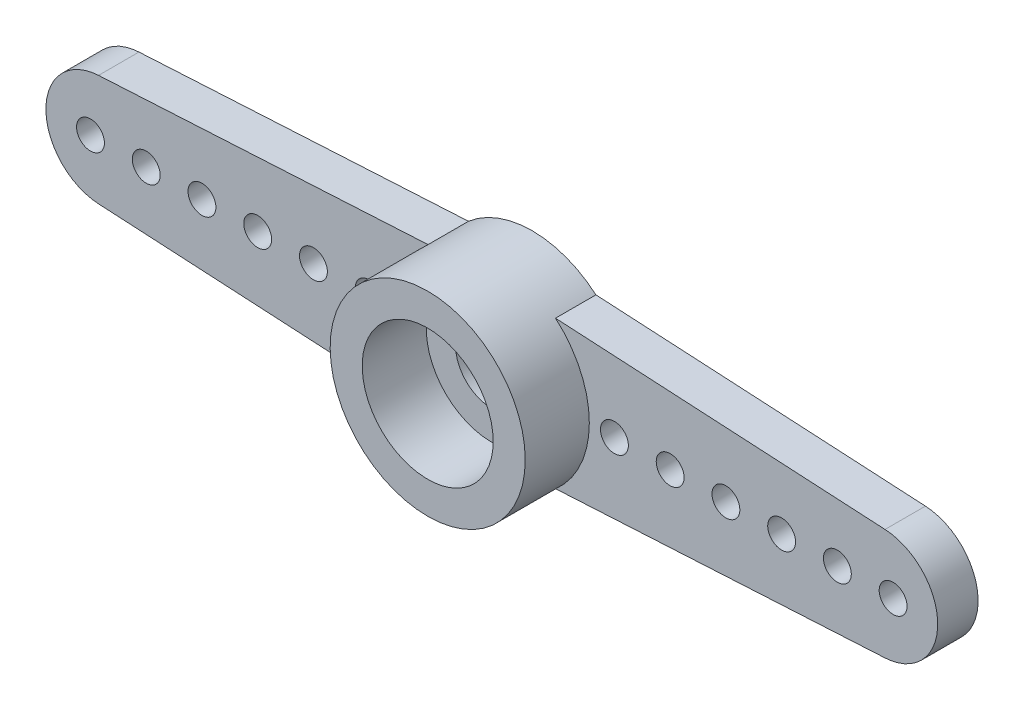
ISO-10303-21;
HEADER;
FILE_DESCRIPTION(('STEP AP214'),'2;1');
FILE_NAME('part.step','',(''),(''),'','','');
FILE_SCHEMA(('AUTOMOTIVE_DESIGN { 1 0 10303 214 1 1 1 1 }'));
ENDSEC;
DATA;
#1=APPLICATION_CONTEXT('core data for automotive mechanical design processes');
#2=APPLICATION_PROTOCOL_DEFINITION('international standard','automotive_design',2000,#1);
#3=PRODUCT_CONTEXT('',#1,'mechanical');
#4=PRODUCT('Part','Part','',(#3));
#5=PRODUCT_RELATED_PRODUCT_CATEGORY('part','',(#4));
#6=PRODUCT_DEFINITION_FORMATION('','',#4);
#7=PRODUCT_DEFINITION_CONTEXT('part definition',#1,'design');
#8=PRODUCT_DEFINITION('design','',#6,#7);
#9=PRODUCT_DEFINITION_SHAPE('','',#8);
#10=(LENGTH_UNIT() NAMED_UNIT(*) SI_UNIT(.MILLI.,.METRE.));
#11=(NAMED_UNIT(*) PLANE_ANGLE_UNIT() SI_UNIT($,.RADIAN.));
#12=(NAMED_UNIT(*) SI_UNIT($,.STERADIAN.) SOLID_ANGLE_UNIT());
#13=UNCERTAINTY_MEASURE_WITH_UNIT(LENGTH_MEASURE(1.E-05),#10,'distance_accuracy_value','');
#14=(GEOMETRIC_REPRESENTATION_CONTEXT(3) GLOBAL_UNCERTAINTY_ASSIGNED_CONTEXT((#13)) GLOBAL_UNIT_ASSIGNED_CONTEXT((#10,
#11,#12)) REPRESENTATION_CONTEXT('',''));
#15=CARTESIAN_POINT('',(0.,0.,0.));
#16=DIRECTION('',(0.,0.,1.));
#17=DIRECTION('',(1.,0.,0.));
#18=AXIS2_PLACEMENT_3D('',#15,#16,#17);
#19=CARTESIAN_POINT('',(0.,0.,1.45));
#20=DIRECTION('',(0.,0.,-1.));
#21=DIRECTION('',(-1.,0.,0.));
#22=AXIS2_PLACEMENT_3D('',#19,#20,#21);
#23=CYLINDRICAL_SURFACE('',#22,3.5);
#24=CARTESIAN_POINT('',(0.,0.,3.75));
#25=DIRECTION('',(0.,0.,1.));
#26=DIRECTION('',(1.,0.,0.));
#27=AXIS2_PLACEMENT_3D('',#24,#25,#26);
#28=CIRCLE('',#27,3.5);
#29=CARTESIAN_POINT('',(3.5,0.,3.75));
#30=VERTEX_POINT('',#29);
#31=EDGE_CURVE('E176',#30,#30,#28,.T.);
#32=ORIENTED_EDGE('',*,*,#31,.F.);
#33=EDGE_LOOP('',(#32));
#34=FACE_BOUND('',#33,.T.);
#35=CARTESIAN_POINT('',(0.,0.,1.45));
#36=DIRECTION('',(0.,0.,1.));
#37=DIRECTION('',(1.,0.,0.));
#38=AXIS2_PLACEMENT_3D('',#35,#36,#37);
#39=CIRCLE('',#38,3.5);
#40=CARTESIAN_POINT('',(2.28637267303474,-2.65,1.45));
#41=VERTEX_POINT('',#40);
#42=CARTESIAN_POINT('',(2.28637267303474,2.65,1.45));
#43=VERTEX_POINT('',#42);
#44=EDGE_CURVE('E184',#41,#43,#39,.T.);
#45=ORIENTED_EDGE('',*,*,#44,.T.);
#46=DIRECTION('',(0.,0.,-1.));
#47=VECTOR('',#46,1.);
#48=CARTESIAN_POINT('',(2.28637267303474,2.65,1.45));
#49=LINE('',#48,#47);
#50=CARTESIAN_POINT('',(2.28637267303474,2.65,0.));
#51=VERTEX_POINT('',#50);
#52=EDGE_CURVE('E202',#43,#51,#49,.T.);
#53=ORIENTED_EDGE('',*,*,#52,.T.);
#54=CARTESIAN_POINT('',(0.,0.,0.));
#55=DIRECTION('',(0.,0.,1.));
#56=DIRECTION('',(1.,0.,0.));
#57=AXIS2_PLACEMENT_3D('',#54,#55,#56);
#58=CIRCLE('',#57,3.5);
#59=CARTESIAN_POINT('',(-2.28637267303474,2.65,0.));
#60=VERTEX_POINT('',#59);
#61=EDGE_CURVE('E203',#51,#60,#58,.T.);
#62=ORIENTED_EDGE('',*,*,#61,.T.);
#63=DIRECTION('',(0.,0.,-1.));
#64=VECTOR('',#63,1.);
#65=CARTESIAN_POINT('',(-2.28637267303474,2.65,1.45));
#66=LINE('',#65,#64);
#67=CARTESIAN_POINT('',(-2.28637267303474,2.65,1.45));
#68=VERTEX_POINT('',#67);
#69=EDGE_CURVE('E64',#68,#60,#66,.T.);
#70=ORIENTED_EDGE('',*,*,#69,.F.);
#71=CARTESIAN_POINT('',(0.,0.,1.45));
#72=DIRECTION('',(0.,0.,1.));
#73=DIRECTION('',(1.,0.,0.));
#74=AXIS2_PLACEMENT_3D('',#71,#72,#73);
#75=CIRCLE('',#74,3.5);
#76=CARTESIAN_POINT('',(-2.28637267303474,-2.65,1.45));
#77=VERTEX_POINT('',#76);
#78=EDGE_CURVE('E59',#68,#77,#75,.T.);
#79=ORIENTED_EDGE('',*,*,#78,.T.);
#80=DIRECTION('',(0.,0.,-1.));
#81=VECTOR('',#80,1.);
#82=CARTESIAN_POINT('',(-2.28637267303474,-2.65,1.45));
#83=LINE('',#82,#81);
#84=CARTESIAN_POINT('',(-2.28637267303474,-2.65,0.));
#85=VERTEX_POINT('',#84);
#86=EDGE_CURVE('E134',#77,#85,#83,.T.);
#87=ORIENTED_EDGE('',*,*,#86,.T.);
#88=CARTESIAN_POINT('',(2.28637267303474,-2.65,0.));
#89=VERTEX_POINT('',#88);
#90=EDGE_CURVE('E183',#85,#89,#58,.T.);
#91=ORIENTED_EDGE('',*,*,#90,.T.);
#92=DIRECTION('',(0.,0.,-1.));
#93=VECTOR('',#92,1.);
#94=CARTESIAN_POINT('',(2.28637267303474,-2.65,1.45));
#95=LINE('',#94,#93);
#96=EDGE_CURVE('E189',#41,#89,#95,.T.);
#97=ORIENTED_EDGE('',*,*,#96,.F.);
#98=EDGE_LOOP('',(#45,#53,#62,#70,#79,#87,#91,#97));
#99=FACE_BOUND('',#98,.T.);
#100=ADVANCED_FACE('F41',(#34,#99),#23,.T.);
#101=CARTESIAN_POINT('',(4.4,0.,3.75));
#102=DIRECTION('',(0.,0.,-1.));
#103=DIRECTION('',(-1.,0.,0.));
#104=AXIS2_PLACEMENT_3D('',#101,#102,#103);
#105=CYLINDRICAL_SURFACE('',#104,0.500000000000001);
#106=CARTESIAN_POINT('',(4.4,0.,1.45));
#107=DIRECTION('',(0.,0.,1.));
#108=DIRECTION('',(1.,0.,0.));
#109=AXIS2_PLACEMENT_3D('',#106,#107,#108);
#110=CIRCLE('',#109,0.500000000000001);
#111=CARTESIAN_POINT('',(4.9,0.,1.45));
#112=VERTEX_POINT('',#111);
#113=EDGE_CURVE('E51',#112,#112,#110,.T.);
#114=ORIENTED_EDGE('',*,*,#113,.T.);
#115=EDGE_LOOP('',(#114));
#116=FACE_BOUND('',#115,.T.);
#117=CARTESIAN_POINT('',(4.4,0.,0.));
#118=DIRECTION('',(0.,0.,-1.));
#119=DIRECTION('',(-1.,0.,0.));
#120=AXIS2_PLACEMENT_3D('',#117,#118,#119);
#121=CIRCLE('',#120,0.500000000000001);
#122=CARTESIAN_POINT('',(3.9,0.,0.));
#123=VERTEX_POINT('',#122);
#124=EDGE_CURVE('E11',#123,#123,#121,.T.);
#125=ORIENTED_EDGE('',*,*,#124,.T.);
#126=EDGE_LOOP('',(#125));
#127=FACE_BOUND('',#126,.T.);
#128=ADVANCED_FACE('F43',(#116,#127),#105,.F.);
#129=CARTESIAN_POINT('',(6.4,0.,3.75));
#130=DIRECTION('',(0.,0.,-1.));
#131=DIRECTION('',(-1.,0.,0.));
#132=AXIS2_PLACEMENT_3D('',#129,#130,#131);
#133=CYLINDRICAL_SURFACE('',#132,0.500000000000001);
#134=CARTESIAN_POINT('',(6.4,0.,1.45));
#135=DIRECTION('',(0.,0.,1.));
#136=DIRECTION('',(1.,0.,0.));
#137=AXIS2_PLACEMENT_3D('',#134,#135,#136);
#138=CIRCLE('',#137,0.500000000000001);
#139=CARTESIAN_POINT('',(6.9,0.,1.45));
#140=VERTEX_POINT('',#139);
#141=EDGE_CURVE('E243',#140,#140,#138,.T.);
#142=ORIENTED_EDGE('',*,*,#141,.T.);
#143=EDGE_LOOP('',(#142));
#144=FACE_BOUND('',#143,.T.);
#145=CARTESIAN_POINT('',(6.4,0.,0.));
#146=DIRECTION('',(0.,0.,-1.));
#147=DIRECTION('',(-1.,0.,0.));
#148=AXIS2_PLACEMENT_3D('',#145,#146,#147);
#149=CIRCLE('',#148,0.500000000000001);
#150=CARTESIAN_POINT('',(5.9,0.,0.));
#151=VERTEX_POINT('',#150);
#152=EDGE_CURVE('E247',#151,#151,#149,.T.);
#153=ORIENTED_EDGE('',*,*,#152,.T.);
#154=EDGE_LOOP('',(#153));
#155=FACE_BOUND('',#154,.T.);
#156=ADVANCED_FACE('F329',(#144,#155),#133,.F.);
#157=CARTESIAN_POINT('',(8.4,0.,3.75));
#158=DIRECTION('',(0.,0.,-1.));
#159=DIRECTION('',(-1.,0.,0.));
#160=AXIS2_PLACEMENT_3D('',#157,#158,#159);
#161=CYLINDRICAL_SURFACE('',#160,0.500000000000001);
#162=CARTESIAN_POINT('',(8.4,0.,1.45));
#163=DIRECTION('',(0.,0.,1.));
#164=DIRECTION('',(1.,0.,0.));
#165=AXIS2_PLACEMENT_3D('',#162,#163,#164);
#166=CIRCLE('',#165,0.500000000000001);
#167=CARTESIAN_POINT('',(8.9,0.,1.45));
#168=VERTEX_POINT('',#167);
#169=EDGE_CURVE('E235',#168,#168,#166,.T.);
#170=ORIENTED_EDGE('',*,*,#169,.T.);
#171=EDGE_LOOP('',(#170));
#172=FACE_BOUND('',#171,.T.);
#173=CARTESIAN_POINT('',(8.4,0.,0.));
#174=DIRECTION('',(0.,0.,-1.));
#175=DIRECTION('',(-1.,0.,0.));
#176=AXIS2_PLACEMENT_3D('',#173,#174,#175);
#177=CIRCLE('',#176,0.500000000000001);
#178=CARTESIAN_POINT('',(7.9,0.,0.));
#179=VERTEX_POINT('',#178);
#180=EDGE_CURVE('E239',#179,#179,#177,.T.);
#181=ORIENTED_EDGE('',*,*,#180,.T.);
#182=EDGE_LOOP('',(#181));
#183=FACE_BOUND('',#182,.T.);
#184=ADVANCED_FACE('F339',(#172,#183),#161,.F.);
#185=CARTESIAN_POINT('',(10.4,0.,3.75));
#186=DIRECTION('',(0.,0.,-1.));
#187=DIRECTION('',(-1.,0.,0.));
#188=AXIS2_PLACEMENT_3D('',#185,#186,#187);
#189=CYLINDRICAL_SURFACE('',#188,0.500000000000001);
#190=CARTESIAN_POINT('',(10.4,0.,1.45));
#191=DIRECTION('',(0.,0.,1.));
#192=DIRECTION('',(1.,0.,0.));
#193=AXIS2_PLACEMENT_3D('',#190,#191,#192);
#194=CIRCLE('',#193,0.500000000000001);
#195=CARTESIAN_POINT('',(10.9,0.,1.45));
#196=VERTEX_POINT('',#195);
#197=EDGE_CURVE('E188',#196,#196,#194,.T.);
#198=ORIENTED_EDGE('',*,*,#197,.T.);
#199=EDGE_LOOP('',(#198));
#200=FACE_BOUND('',#199,.T.);
#201=CARTESIAN_POINT('',(10.4,0.,0.));
#202=DIRECTION('',(0.,0.,-1.));
#203=DIRECTION('',(-1.,0.,0.));
#204=AXIS2_PLACEMENT_3D('',#201,#202,#203);
#205=CIRCLE('',#204,0.500000000000001);
#206=CARTESIAN_POINT('',(9.9,0.,0.));
#207=VERTEX_POINT('',#206);
#208=EDGE_CURVE('E231',#207,#207,#205,.T.);
#209=ORIENTED_EDGE('',*,*,#208,.T.);
#210=EDGE_LOOP('',(#209));
#211=FACE_BOUND('',#210,.T.);
#212=ADVANCED_FACE('F336',(#200,#211),#189,.F.);
#213=CARTESIAN_POINT('',(0.152869471242723,-2.76783488533948,1.45));
#214=DIRECTION('',(0.055146658226505,-0.998478265204831,0.));
#215=DIRECTION('',(0.998478265204831,0.055146658226505,0.));
#216=AXIS2_PLACEMENT_3D('',#213,#214,#215);
#217=PLANE('',#216);
#218=DIRECTION('',(-0.998478265204831,-0.055146658226505,0.));
#219=VECTOR('',#218,1.);
#220=CARTESIAN_POINT('',(0.152869471242723,-2.76783488533948,0.));
#221=LINE('',#220,#219);
#222=CARTESIAN_POINT('',(14.110293316453,-1.99695653040966,0.));
#223=VERTEX_POINT('',#222);
#224=EDGE_CURVE('E206',#223,#89,#221,.T.);
#225=ORIENTED_EDGE('',*,*,#224,.F.);
#226=DIRECTION('',(0.,0.,-1.));
#227=VECTOR('',#226,1.);
#228=CARTESIAN_POINT('',(14.110293316453,-1.99695653040966,1.45));
#229=LINE('',#228,#227);
#230=CARTESIAN_POINT('',(14.110293316453,-1.99695653040966,1.45));
#231=VERTEX_POINT('',#230);
#232=EDGE_CURVE('E222',#231,#223,#229,.T.);
#233=ORIENTED_EDGE('',*,*,#232,.F.);
#234=DIRECTION('',(-0.998478265204831,-0.055146658226505,0.));
#235=VECTOR('',#234,1.);
#236=CARTESIAN_POINT('',(0.152869471242723,-2.76783488533948,1.45));
#237=LINE('',#236,#235);
#238=EDGE_CURVE('E190',#231,#41,#237,.T.);
#239=ORIENTED_EDGE('',*,*,#238,.T.);
#240=ORIENTED_EDGE('',*,*,#96,.T.);
#241=EDGE_LOOP('',(#225,#233,#239,#240));
#242=FACE_BOUND('',#241,.T.);
#243=ADVANCED_FACE('F334',(#242),#217,.T.);
#244=CARTESIAN_POINT('',(14.,0.,1.45));
#245=DIRECTION('',(0.,0.,-1.));
#246=DIRECTION('',(-1.,0.,0.));
#247=AXIS2_PLACEMENT_3D('',#244,#245,#246);
#248=CYLINDRICAL_SURFACE('',#247,2.);
#249=CARTESIAN_POINT('',(14.,0.,0.));
#250=DIRECTION('',(0.,0.,1.));
#251=DIRECTION('',(1.,0.,0.));
#252=AXIS2_PLACEMENT_3D('',#249,#250,#251);
#253=CIRCLE('',#252,2.);
#254=CARTESIAN_POINT('',(14.110293316453,1.99695653040966,0.));
#255=VERTEX_POINT('',#254);
#256=EDGE_CURVE('E210',#223,#255,#253,.T.);
#257=ORIENTED_EDGE('',*,*,#256,.T.);
#258=DIRECTION('',(0.,0.,-1.));
#259=VECTOR('',#258,1.);
#260=CARTESIAN_POINT('',(14.110293316453,1.99695653040966,1.45));
#261=LINE('',#260,#259);
#262=CARTESIAN_POINT('',(14.110293316453,1.99695653040966,1.45));
#263=VERTEX_POINT('',#262);
#264=EDGE_CURVE('E219',#263,#255,#261,.T.);
#265=ORIENTED_EDGE('',*,*,#264,.F.);
#266=CARTESIAN_POINT('',(14.,0.,1.45));
#267=DIRECTION('',(0.,0.,1.));
#268=DIRECTION('',(1.,0.,0.));
#269=AXIS2_PLACEMENT_3D('',#266,#267,#268);
#270=CIRCLE('',#269,2.);
#271=EDGE_CURVE('E194',#231,#263,#270,.T.);
#272=ORIENTED_EDGE('',*,*,#271,.F.);
#273=ORIENTED_EDGE('',*,*,#232,.T.);
#274=EDGE_LOOP('',(#257,#265,#272,#273));
#275=FACE_BOUND('',#274,.T.);
#276=ADVANCED_FACE('F374',(#275),#248,.T.);
#277=CARTESIAN_POINT('',(0.152869471242723,2.76783488533948,1.45));
#278=DIRECTION('',(0.055146658226505,0.998478265204831,0.));
#279=DIRECTION('',(-0.998478265204831,0.055146658226505,0.));
#280=AXIS2_PLACEMENT_3D('',#277,#278,#279);
#281=PLANE('',#280);
#282=DIRECTION('',(0.998478265204831,-0.055146658226505,0.));
#283=VECTOR('',#282,1.);
#284=CARTESIAN_POINT('',(0.152869471242723,2.76783488533948,0.));
#285=LINE('',#284,#283);
#286=EDGE_CURVE('E195',#51,#255,#285,.T.);
#287=ORIENTED_EDGE('',*,*,#286,.F.);
#288=ORIENTED_EDGE('',*,*,#52,.F.);
#289=DIRECTION('',(0.998478265204831,-0.055146658226505,0.));
#290=VECTOR('',#289,1.);
#291=CARTESIAN_POINT('',(0.152869471242723,2.76783488533948,1.45));
#292=LINE('',#291,#290);
#293=EDGE_CURVE('E198',#43,#263,#292,.T.);
#294=ORIENTED_EDGE('',*,*,#293,.T.);
#295=ORIENTED_EDGE('',*,*,#264,.T.);
#296=EDGE_LOOP('',(#287,#288,#294,#295));
#297=FACE_BOUND('',#296,.T.);
#298=ADVANCED_FACE('F366',(#297),#281,.T.);
#299=CARTESIAN_POINT('',(0.,0.,1.45));
#300=DIRECTION('',(0.,0.,1.));
#301=DIRECTION('',(1.,0.,0.));
#302=AXIS2_PLACEMENT_3D('',#299,#300,#301);
#303=PLANE('',#302);
#304=CARTESIAN_POINT('',(12.4,0.,1.45));
#305=DIRECTION('',(0.,0.,1.));
#306=DIRECTION('',(1.,0.,0.));
#307=AXIS2_PLACEMENT_3D('',#304,#305,#306);
#308=CIRCLE('',#307,0.500000000000001);
#309=CARTESIAN_POINT('',(12.9,0.,1.45));
#310=VERTEX_POINT('',#309);
#311=EDGE_CURVE('E155',#310,#310,#308,.T.);
#312=ORIENTED_EDGE('',*,*,#311,.F.);
#313=EDGE_LOOP('',(#312));
#314=FACE_BOUND('',#313,.T.);
#315=CARTESIAN_POINT('',(14.4,0.,1.45));
#316=DIRECTION('',(0.,0.,1.));
#317=DIRECTION('',(1.,0.,0.));
#318=AXIS2_PLACEMENT_3D('',#315,#316,#317);
#319=CIRCLE('',#318,0.500000000000001);
#320=CARTESIAN_POINT('',(14.9,0.,1.45));
#321=VERTEX_POINT('',#320);
#322=EDGE_CURVE('E167',#321,#321,#319,.T.);
#323=ORIENTED_EDGE('',*,*,#322,.F.);
#324=EDGE_LOOP('',(#323));
#325=FACE_BOUND('',#324,.T.);
#326=ORIENTED_EDGE('',*,*,#44,.F.);
#327=ORIENTED_EDGE('',*,*,#238,.F.);
#328=ORIENTED_EDGE('',*,*,#271,.T.);
#329=ORIENTED_EDGE('',*,*,#293,.F.);
#330=EDGE_LOOP('',(#326,#327,#328,#329));
#331=FACE_BOUND('',#330,.T.);
#332=ORIENTED_EDGE('',*,*,#197,.F.);
#333=EDGE_LOOP('',(#332));
#334=FACE_BOUND('',#333,.T.);
#335=ORIENTED_EDGE('',*,*,#169,.F.);
#336=EDGE_LOOP('',(#335));
#337=FACE_BOUND('',#336,.T.);
#338=ORIENTED_EDGE('',*,*,#141,.F.);
#339=EDGE_LOOP('',(#338));
#340=FACE_BOUND('',#339,.T.);
#341=ORIENTED_EDGE('',*,*,#113,.F.);
#342=EDGE_LOOP('',(#341));
#343=FACE_BOUND('',#342,.T.);
#344=ADVANCED_FACE('F354',(#314,#325,#331,#334,#337,#340,#343),#303,.T.);
#345=CARTESIAN_POINT('',(0.,0.,0.));
#346=DIRECTION('',(0.,0.,1.));
#347=DIRECTION('',(1.,0.,0.));
#348=AXIS2_PLACEMENT_3D('',#345,#346,#347);
#349=PLANE('',#348);
#350=CARTESIAN_POINT('',(-12.4,0.,0.));
#351=DIRECTION('',(0.,0.,1.));
#352=DIRECTION('',(1.,0.,0.));
#353=AXIS2_PLACEMENT_3D('',#350,#351,#352);
#354=CIRCLE('',#353,0.500000000000001);
#355=CARTESIAN_POINT('',(-11.9,0.,0.));
#356=VERTEX_POINT('',#355);
#357=EDGE_CURVE('E270',#356,#356,#354,.T.);
#358=ORIENTED_EDGE('',*,*,#357,.T.);
#359=EDGE_LOOP('',(#358));
#360=FACE_BOUND('',#359,.T.);
#361=CARTESIAN_POINT('',(-10.4,0.,0.));
#362=DIRECTION('',(0.,0.,1.));
#363=DIRECTION('',(1.,0.,0.));
#364=AXIS2_PLACEMENT_3D('',#361,#362,#363);
#365=CIRCLE('',#364,0.500000000000001);
#366=CARTESIAN_POINT('',(-9.9,0.,0.));
#367=VERTEX_POINT('',#366);
#368=EDGE_CURVE('E609',#367,#367,#365,.T.);
#369=ORIENTED_EDGE('',*,*,#368,.T.);
#370=EDGE_LOOP('',(#369));
#371=FACE_BOUND('',#370,.T.);
#372=CARTESIAN_POINT('',(-8.4,0.,0.));
#373=DIRECTION('',(0.,0.,1.));
#374=DIRECTION('',(1.,0.,0.));
#375=AXIS2_PLACEMENT_3D('',#372,#373,#374);
#376=CIRCLE('',#375,0.500000000000001);
#377=CARTESIAN_POINT('',(-7.9,0.,0.));
#378=VERTEX_POINT('',#377);
#379=EDGE_CURVE('E613',#378,#378,#376,.T.);
#380=ORIENTED_EDGE('',*,*,#379,.T.);
#381=EDGE_LOOP('',(#380));
#382=FACE_BOUND('',#381,.T.);
#383=CARTESIAN_POINT('',(-6.4,0.,0.));
#384=DIRECTION('',(0.,0.,1.));
#385=DIRECTION('',(1.,0.,0.));
#386=AXIS2_PLACEMENT_3D('',#383,#384,#385);
#387=CIRCLE('',#386,0.500000000000001);
#388=CARTESIAN_POINT('',(-5.9,0.,0.));
#389=VERTEX_POINT('',#388);
#390=EDGE_CURVE('E618',#389,#389,#387,.T.);
#391=ORIENTED_EDGE('',*,*,#390,.T.);
#392=EDGE_LOOP('',(#391));
#393=FACE_BOUND('',#392,.T.);
#394=CARTESIAN_POINT('',(-4.4,0.,0.));
#395=DIRECTION('',(0.,0.,1.));
#396=DIRECTION('',(1.,0.,0.));
#397=AXIS2_PLACEMENT_3D('',#394,#395,#396);
#398=CIRCLE('',#397,0.500000000000001);
#399=CARTESIAN_POINT('',(-3.9,0.,0.));
#400=VERTEX_POINT('',#399);
#401=EDGE_CURVE('E293',#400,#400,#398,.T.);
#402=ORIENTED_EDGE('',*,*,#401,.T.);
#403=EDGE_LOOP('',(#402));
#404=FACE_BOUND('',#403,.T.);
#405=CARTESIAN_POINT('',(-14.4,0.,0.));
#406=DIRECTION('',(0.,0.,1.));
#407=DIRECTION('',(1.,0.,0.));
#408=AXIS2_PLACEMENT_3D('',#405,#406,#407);
#409=CIRCLE('',#408,0.500000000000001);
#410=CARTESIAN_POINT('',(-13.9,0.,0.));
#411=VERTEX_POINT('',#410);
#412=EDGE_CURVE('E264',#411,#411,#409,.T.);
#413=ORIENTED_EDGE('',*,*,#412,.T.);
#414=EDGE_LOOP('',(#413));
#415=FACE_BOUND('',#414,.T.);
#416=CARTESIAN_POINT('',(0.,0.,0.));
#417=DIRECTION('',(0.,0.,1.));
#418=DIRECTION('',(1.,0.,0.));
#419=AXIS2_PLACEMENT_3D('',#416,#417,#418);
#420=CIRCLE('',#419,2.3);
#421=CARTESIAN_POINT('',(2.3,0.,0.));
#422=VERTEX_POINT('',#421);
#423=EDGE_CURVE('E258',#422,#422,#420,.T.);
#424=ORIENTED_EDGE('',*,*,#423,.T.);
#425=EDGE_LOOP('',(#424));
#426=FACE_BOUND('',#425,.T.);
#427=CARTESIAN_POINT('',(12.4,0.,0.));
#428=DIRECTION('',(0.,0.,-1.));
#429=DIRECTION('',(-1.,0.,0.));
#430=AXIS2_PLACEMENT_3D('',#427,#428,#429);
#431=CIRCLE('',#430,0.500000000000001);
#432=CARTESIAN_POINT('',(11.9,0.,0.));
#433=VERTEX_POINT('',#432);
#434=EDGE_CURVE('E159',#433,#433,#431,.T.);
#435=ORIENTED_EDGE('',*,*,#434,.F.);
#436=EDGE_LOOP('',(#435));
#437=FACE_BOUND('',#436,.T.);
#438=CARTESIAN_POINT('',(14.4,0.,0.));
#439=DIRECTION('',(0.,0.,-1.));
#440=DIRECTION('',(-1.,0.,0.));
#441=AXIS2_PLACEMENT_3D('',#438,#439,#440);
#442=CIRCLE('',#441,0.500000000000001);
#443=CARTESIAN_POINT('',(13.9,0.,0.));
#444=VERTEX_POINT('',#443);
#445=EDGE_CURVE('E163',#444,#444,#442,.T.);
#446=ORIENTED_EDGE('',*,*,#445,.F.);
#447=EDGE_LOOP('',(#446));
#448=FACE_BOUND('',#447,.T.);
#449=ORIENTED_EDGE('',*,*,#224,.T.);
#450=ORIENTED_EDGE('',*,*,#90,.F.);
#451=DIRECTION('',(0.998478265204831,-0.055146658226505,0.));
#452=VECTOR('',#451,1.);
#453=CARTESIAN_POINT('',(-0.152869471242723,-2.76783488533948,0.));
#454=LINE('',#453,#452);
#455=CARTESIAN_POINT('',(-14.110293316453,-1.99695653040966,0.));
#456=VERTEX_POINT('',#455);
#457=EDGE_CURVE('E115',#456,#85,#454,.T.);
#458=ORIENTED_EDGE('',*,*,#457,.F.);
#459=CARTESIAN_POINT('',(-14.,0.,0.));
#460=DIRECTION('',(0.,0.,-1.));
#461=DIRECTION('',(-1.,0.,0.));
#462=AXIS2_PLACEMENT_3D('',#459,#460,#461);
#463=CIRCLE('',#462,2.);
#464=CARTESIAN_POINT('',(-14.110293316453,1.99695653040966,0.));
#465=VERTEX_POINT('',#464);
#466=EDGE_CURVE('E140',#456,#465,#463,.T.);
#467=ORIENTED_EDGE('',*,*,#466,.T.);
#468=DIRECTION('',(-0.998478265204831,-0.055146658226505,0.));
#469=VECTOR('',#468,1.);
#470=CARTESIAN_POINT('',(-0.152869471242723,2.76783488533948,0.));
#471=LINE('',#470,#469);
#472=EDGE_CURVE('E121',#60,#465,#471,.T.);
#473=ORIENTED_EDGE('',*,*,#472,.F.);
#474=ORIENTED_EDGE('',*,*,#61,.F.);
#475=ORIENTED_EDGE('',*,*,#286,.T.);
#476=ORIENTED_EDGE('',*,*,#256,.F.);
#477=EDGE_LOOP('',(#449,#450,#458,#467,#473,#474,#475,#476));
#478=FACE_BOUND('',#477,.T.);
#479=ORIENTED_EDGE('',*,*,#208,.F.);
#480=EDGE_LOOP('',(#479));
#481=FACE_BOUND('',#480,.T.);
#482=ORIENTED_EDGE('',*,*,#180,.F.);
#483=EDGE_LOOP('',(#482));
#484=FACE_BOUND('',#483,.T.);
#485=ORIENTED_EDGE('',*,*,#152,.F.);
#486=EDGE_LOOP('',(#485));
#487=FACE_BOUND('',#486,.T.);
#488=ORIENTED_EDGE('',*,*,#124,.F.);
#489=EDGE_LOOP('',(#488));
#490=FACE_BOUND('',#489,.T.);
#491=ADVANCED_FACE('F304',(#360,#371,#382,#393,#404,#415,#426,#437,#448,#478,#481,#484,#487,
#490),#349,.F.);
#492=CARTESIAN_POINT('',(0.,0.,3.75));
#493=DIRECTION('',(0.,0.,1.));
#494=DIRECTION('',(1.,0.,0.));
#495=AXIS2_PLACEMENT_3D('',#492,#493,#494);
#496=PLANE('',#495);
#497=ORIENTED_EDGE('',*,*,#31,.T.);
#498=EDGE_LOOP('',(#497));
#499=FACE_BOUND('',#498,.T.);
#500=CARTESIAN_POINT('',(0.,0.,3.75));
#501=DIRECTION('',(0.,0.,1.));
#502=DIRECTION('',(1.,0.,0.));
#503=AXIS2_PLACEMENT_3D('',#500,#501,#502);
#504=CIRCLE('',#503,2.35);
#505=CARTESIAN_POINT('',(2.35,0.,3.75));
#506=VERTEX_POINT('',#505);
#507=EDGE_CURVE('E172',#506,#506,#504,.T.);
#508=ORIENTED_EDGE('',*,*,#507,.F.);
#509=EDGE_LOOP('',(#508));
#510=FACE_BOUND('',#509,.T.);
#511=ADVANCED_FACE('F353',(#499,#510),#496,.T.);
#512=CARTESIAN_POINT('',(0.,0.,3.75));
#513=DIRECTION('',(0.,0.,-1.));
#514=DIRECTION('',(-1.,0.,0.));
#515=AXIS2_PLACEMENT_3D('',#512,#513,#514);
#516=CYLINDRICAL_SURFACE('',#515,2.35);
#517=ORIENTED_EDGE('',*,*,#507,.T.);
#518=EDGE_LOOP('',(#517));
#519=FACE_BOUND('',#518,.T.);
#520=CARTESIAN_POINT('',(0.,0.,1.45));
#521=DIRECTION('',(0.,0.,1.));
#522=DIRECTION('',(1.,0.,0.));
#523=AXIS2_PLACEMENT_3D('',#520,#521,#522);
#524=CIRCLE('',#523,2.35);
#525=CARTESIAN_POINT('',(2.35,0.,1.45));
#526=VERTEX_POINT('',#525);
#527=EDGE_CURVE('E171',#526,#526,#524,.T.);
#528=ORIENTED_EDGE('',*,*,#527,.F.);
#529=EDGE_LOOP('',(#528));
#530=FACE_BOUND('',#529,.T.);
#531=ADVANCED_FACE('F363',(#519,#530),#516,.F.);
#532=CARTESIAN_POINT('',(0.,0.,1.45));
#533=DIRECTION('',(0.,0.,1.));
#534=DIRECTION('',(1.,0.,0.));
#535=AXIS2_PLACEMENT_3D('',#532,#533,#534);
#536=CIRCLE('',#535,1.3);
#537=CARTESIAN_POINT('',(1.3,0.,1.45));
#538=VERTEX_POINT('',#537);
#539=EDGE_CURVE('E254',#538,#538,#536,.F.);
#540=ORIENTED_EDGE('',*,*,#539,.T.);
#541=EDGE_LOOP('',(#540));
#542=FACE_BOUND('',#541,.T.);
#543=ORIENTED_EDGE('',*,*,#527,.T.);
#544=EDGE_LOOP('',(#543));
#545=FACE_BOUND('',#544,.T.);
#546=ADVANCED_FACE('F369',(#542,#545),#303,.T.);
#547=CARTESIAN_POINT('',(14.4,0.,3.75));
#548=DIRECTION('',(0.,0.,-1.));
#549=DIRECTION('',(-1.,0.,0.));
#550=AXIS2_PLACEMENT_3D('',#547,#548,#549);
#551=CYLINDRICAL_SURFACE('',#550,0.500000000000001);
#552=ORIENTED_EDGE('',*,*,#322,.T.);
#553=EDGE_LOOP('',(#552));
#554=FACE_BOUND('',#553,.T.);
#555=ORIENTED_EDGE('',*,*,#445,.T.);
#556=EDGE_LOOP('',(#555));
#557=FACE_BOUND('',#556,.T.);
#558=ADVANCED_FACE('F438',(#554,#557),#551,.F.);
#559=CARTESIAN_POINT('',(12.4,0.,3.75));
#560=DIRECTION('',(0.,0.,-1.));
#561=DIRECTION('',(-1.,0.,0.));
#562=AXIS2_PLACEMENT_3D('',#559,#560,#561);
#563=CYLINDRICAL_SURFACE('',#562,0.500000000000001);
#564=ORIENTED_EDGE('',*,*,#311,.T.);
#565=EDGE_LOOP('',(#564));
#566=FACE_BOUND('',#565,.T.);
#567=ORIENTED_EDGE('',*,*,#434,.T.);
#568=EDGE_LOOP('',(#567));
#569=FACE_BOUND('',#568,.T.);
#570=ADVANCED_FACE('F442',(#566,#569),#563,.F.);
#571=CARTESIAN_POINT('',(0.,0.,1.45));
#572=DIRECTION('',(0.,0.,1.));
#573=DIRECTION('',(-1.,0.,0.));
#574=AXIS2_PLACEMENT_3D('',#571,#572,#573);
#575=PLANE('',#574);
#576=CARTESIAN_POINT('',(-12.4,0.,1.45));
#577=DIRECTION('',(0.,0.,1.));
#578=DIRECTION('',(1.,0.,0.));
#579=AXIS2_PLACEMENT_3D('',#576,#577,#578);
#580=CIRCLE('',#579,0.500000000000001);
#581=CARTESIAN_POINT('',(-11.9,0.,1.45));
#582=VERTEX_POINT('',#581);
#583=EDGE_CURVE('E45',#582,#582,#580,.F.);
#584=ORIENTED_EDGE('',*,*,#583,.T.);
#585=EDGE_LOOP('',(#584));
#586=FACE_BOUND('',#585,.T.);
#587=CARTESIAN_POINT('',(-10.4,0.,1.45));
#588=DIRECTION('',(0.,0.,1.));
#589=DIRECTION('',(1.,0.,0.));
#590=AXIS2_PLACEMENT_3D('',#587,#588,#589);
#591=CIRCLE('',#590,0.500000000000001);
#592=CARTESIAN_POINT('',(-9.9,0.,1.45));
#593=VERTEX_POINT('',#592);
#594=EDGE_CURVE('E277',#593,#593,#591,.F.);
#595=ORIENTED_EDGE('',*,*,#594,.T.);
#596=EDGE_LOOP('',(#595));
#597=FACE_BOUND('',#596,.T.);
#598=CARTESIAN_POINT('',(-8.4,0.,1.45));
#599=DIRECTION('',(0.,0.,1.));
#600=DIRECTION('',(1.,0.,0.));
#601=AXIS2_PLACEMENT_3D('',#598,#599,#600);
#602=CIRCLE('',#601,0.500000000000001);
#603=CARTESIAN_POINT('',(-7.9,0.,1.45));
#604=VERTEX_POINT('',#603);
#605=EDGE_CURVE('E274',#604,#604,#602,.F.);
#606=ORIENTED_EDGE('',*,*,#605,.T.);
#607=EDGE_LOOP('',(#606));
#608=FACE_BOUND('',#607,.T.);
#609=CARTESIAN_POINT('',(-6.4,0.,1.45));
#610=DIRECTION('',(0.,0.,1.));
#611=DIRECTION('',(1.,0.,0.));
#612=AXIS2_PLACEMENT_3D('',#609,#610,#611);
#613=CIRCLE('',#612,0.500000000000001);
#614=CARTESIAN_POINT('',(-5.9,0.,1.45));
#615=VERTEX_POINT('',#614);
#616=EDGE_CURVE('E269',#615,#615,#613,.F.);
#617=ORIENTED_EDGE('',*,*,#616,.T.);
#618=EDGE_LOOP('',(#617));
#619=FACE_BOUND('',#618,.T.);
#620=CARTESIAN_POINT('',(-4.4,0.,1.45));
#621=DIRECTION('',(0.,0.,1.));
#622=DIRECTION('',(1.,0.,0.));
#623=AXIS2_PLACEMENT_3D('',#620,#621,#622);
#624=CIRCLE('',#623,0.500000000000001);
#625=CARTESIAN_POINT('',(-3.9,0.,1.45));
#626=VERTEX_POINT('',#625);
#627=EDGE_CURVE('E265',#626,#626,#624,.F.);
#628=ORIENTED_EDGE('',*,*,#627,.T.);
#629=EDGE_LOOP('',(#628));
#630=FACE_BOUND('',#629,.T.);
#631=CARTESIAN_POINT('',(-14.4,0.,1.45));
#632=DIRECTION('',(0.,0.,1.));
#633=DIRECTION('',(1.,0.,0.));
#634=AXIS2_PLACEMENT_3D('',#631,#632,#633);
#635=CIRCLE('',#634,0.500000000000001);
#636=CARTESIAN_POINT('',(-13.9,0.,1.45));
#637=VERTEX_POINT('',#636);
#638=EDGE_CURVE('E260',#637,#637,#635,.F.);
#639=ORIENTED_EDGE('',*,*,#638,.T.);
#640=EDGE_LOOP('',(#639));
#641=FACE_BOUND('',#640,.T.);
#642=ORIENTED_EDGE('',*,*,#78,.F.);
#643=DIRECTION('',(-0.998478265204831,-0.055146658226505,0.));
#644=VECTOR('',#643,1.);
#645=CARTESIAN_POINT('',(-0.152869471242723,2.76783488533948,1.45));
#646=LINE('',#645,#644);
#647=CARTESIAN_POINT('',(-14.110293316453,1.99695653040966,1.45));
#648=VERTEX_POINT('',#647);
#649=EDGE_CURVE('E108',#68,#648,#646,.T.);
#650=ORIENTED_EDGE('',*,*,#649,.T.);
#651=CARTESIAN_POINT('',(-14.,0.,1.45));
#652=DIRECTION('',(0.,0.,-1.));
#653=DIRECTION('',(-1.,0.,0.));
#654=AXIS2_PLACEMENT_3D('',#651,#652,#653);
#655=CIRCLE('',#654,2.);
#656=CARTESIAN_POINT('',(-14.110293316453,-1.99695653040966,1.45));
#657=VERTEX_POINT('',#656);
#658=EDGE_CURVE('E112',#657,#648,#655,.T.);
#659=ORIENTED_EDGE('',*,*,#658,.F.);
#660=DIRECTION('',(0.998478265204831,-0.055146658226505,0.));
#661=VECTOR('',#660,1.);
#662=CARTESIAN_POINT('',(-0.152869471242723,-2.76783488533948,1.45));
#663=LINE('',#662,#661);
#664=EDGE_CURVE('E131',#657,#77,#663,.T.);
#665=ORIENTED_EDGE('',*,*,#664,.T.);
#666=EDGE_LOOP('',(#642,#650,#659,#665));
#667=FACE_BOUND('',#666,.T.);
#668=ADVANCED_FACE('F110',(#586,#597,#608,#619,#630,#641,#667),#575,.T.);
#669=CARTESIAN_POINT('',(-0.152869471242723,2.76783488533948,1.45));
#670=DIRECTION('',(0.055146658226505,-0.998478265204831,0.));
#671=DIRECTION('',(0.998478265204831,0.055146658226505,0.));
#672=AXIS2_PLACEMENT_3D('',#669,#670,#671);
#673=PLANE('',#672);
#674=ORIENTED_EDGE('',*,*,#472,.T.);
#675=DIRECTION('',(0.,0.,-1.));
#676=VECTOR('',#675,1.);
#677=CARTESIAN_POINT('',(-14.110293316453,1.99695653040966,1.45));
#678=LINE('',#677,#676);
#679=EDGE_CURVE('E118',#648,#465,#678,.T.);
#680=ORIENTED_EDGE('',*,*,#679,.F.);
#681=ORIENTED_EDGE('',*,*,#649,.F.);
#682=ORIENTED_EDGE('',*,*,#69,.T.);
#683=EDGE_LOOP('',(#674,#680,#681,#682));
#684=FACE_BOUND('',#683,.T.);
#685=ADVANCED_FACE('F119',(#684),#673,.F.);
#686=CARTESIAN_POINT('',(-14.,0.,1.45));
#687=DIRECTION('',(0.,0.,-1.));
#688=DIRECTION('',(-1.,0.,0.));
#689=AXIS2_PLACEMENT_3D('',#686,#687,#688);
#690=CYLINDRICAL_SURFACE('',#689,2.);
#691=ORIENTED_EDGE('',*,*,#466,.F.);
#692=DIRECTION('',(0.,0.,-1.));
#693=VECTOR('',#692,1.);
#694=CARTESIAN_POINT('',(-14.110293316453,-1.99695653040966,1.45));
#695=LINE('',#694,#693);
#696=EDGE_CURVE('E126',#657,#456,#695,.T.);
#697=ORIENTED_EDGE('',*,*,#696,.F.);
#698=ORIENTED_EDGE('',*,*,#658,.T.);
#699=ORIENTED_EDGE('',*,*,#679,.T.);
#700=EDGE_LOOP('',(#691,#697,#698,#699));
#701=FACE_BOUND('',#700,.T.);
#702=ADVANCED_FACE('F128',(#701),#690,.T.);
#703=CARTESIAN_POINT('',(-0.152869471242723,-2.76783488533948,1.45));
#704=DIRECTION('',(0.055146658226505,0.998478265204831,0.));
#705=DIRECTION('',(-0.998478265204831,0.055146658226505,0.));
#706=AXIS2_PLACEMENT_3D('',#703,#704,#705);
#707=PLANE('',#706);
#708=ORIENTED_EDGE('',*,*,#457,.T.);
#709=ORIENTED_EDGE('',*,*,#86,.F.);
#710=ORIENTED_EDGE('',*,*,#664,.F.);
#711=ORIENTED_EDGE('',*,*,#696,.T.);
#712=EDGE_LOOP('',(#708,#709,#710,#711));
#713=FACE_BOUND('',#712,.T.);
#714=ADVANCED_FACE('F310',(#713),#707,.F.);
#715=CARTESIAN_POINT('',(0.,0.,0.7));
#716=DIRECTION('',(0.,0.,-1.));
#717=DIRECTION('',(-1.,0.,0.));
#718=AXIS2_PLACEMENT_3D('',#715,#716,#717);
#719=CYLINDRICAL_SURFACE('',#718,2.3);
#720=CARTESIAN_POINT('',(0.,0.,0.7));
#721=DIRECTION('',(0.,0.,1.));
#722=DIRECTION('',(1.,0.,0.));
#723=AXIS2_PLACEMENT_3D('',#720,#721,#722);
#724=CIRCLE('',#723,2.3);
#725=CARTESIAN_POINT('',(2.3,0.,0.7));
#726=VERTEX_POINT('',#725);
#727=EDGE_CURVE('E141',#726,#726,#724,.T.);
#728=ORIENTED_EDGE('',*,*,#727,.T.);
#729=EDGE_LOOP('',(#728));
#730=FACE_BOUND('',#729,.T.);
#731=ORIENTED_EDGE('',*,*,#423,.F.);
#732=EDGE_LOOP('',(#731));
#733=FACE_BOUND('',#732,.T.);
#734=ADVANCED_FACE('F307',(#730,#733),#719,.F.);
#735=CARTESIAN_POINT('',(0.,0.,0.7));
#736=DIRECTION('',(0.,0.,-1.));
#737=DIRECTION('',(1.,0.,0.));
#738=AXIS2_PLACEMENT_3D('',#735,#736,#737);
#739=PLANE('',#738);
#740=CARTESIAN_POINT('',(0.,0.,0.7));
#741=DIRECTION('',(0.,0.,1.));
#742=DIRECTION('',(1.,0.,0.));
#743=AXIS2_PLACEMENT_3D('',#740,#741,#742);
#744=CIRCLE('',#743,1.3);
#745=CARTESIAN_POINT('',(1.3,0.,0.7));
#746=VERTEX_POINT('',#745);
#747=EDGE_CURVE('E259',#746,#746,#744,.T.);
#748=ORIENTED_EDGE('',*,*,#747,.T.);
#749=EDGE_LOOP('',(#748));
#750=FACE_BOUND('',#749,.T.);
#751=ORIENTED_EDGE('',*,*,#727,.F.);
#752=EDGE_LOOP('',(#751));
#753=FACE_BOUND('',#752,.T.);
#754=ADVANCED_FACE('F309',(#750,#753),#739,.T.);
#755=CARTESIAN_POINT('',(0.,0.,3.75));
#756=DIRECTION('',(0.,0.,-1.));
#757=DIRECTION('',(-1.,0.,0.));
#758=AXIS2_PLACEMENT_3D('',#755,#756,#757);
#759=CYLINDRICAL_SURFACE('',#758,1.3);
#760=ORIENTED_EDGE('',*,*,#539,.F.);
#761=EDGE_LOOP('',(#760));
#762=FACE_BOUND('',#761,.T.);
#763=ORIENTED_EDGE('',*,*,#747,.F.);
#764=EDGE_LOOP('',(#763));
#765=FACE_BOUND('',#764,.T.);
#766=ADVANCED_FACE('F317',(#762,#765),#759,.F.);
#767=CARTESIAN_POINT('',(-14.4,0.,3.75));
#768=DIRECTION('',(0.,0.,-1.));
#769=DIRECTION('',(-1.,0.,0.));
#770=AXIS2_PLACEMENT_3D('',#767,#768,#769);
#771=CYLINDRICAL_SURFACE('',#770,0.500000000000001);
#772=ORIENTED_EDGE('',*,*,#638,.F.);
#773=EDGE_LOOP('',(#772));
#774=FACE_BOUND('',#773,.T.);
#775=ORIENTED_EDGE('',*,*,#412,.F.);
#776=EDGE_LOOP('',(#775));
#777=FACE_BOUND('',#776,.T.);
#778=ADVANCED_FACE('F542',(#774,#777),#771,.F.);
#779=CARTESIAN_POINT('',(-4.4,0.,3.75));
#780=DIRECTION('',(0.,0.,-1.));
#781=DIRECTION('',(-1.,0.,0.));
#782=AXIS2_PLACEMENT_3D('',#779,#780,#781);
#783=CYLINDRICAL_SURFACE('',#782,0.500000000000001);
#784=ORIENTED_EDGE('',*,*,#627,.F.);
#785=EDGE_LOOP('',(#784));
#786=FACE_BOUND('',#785,.T.);
#787=ORIENTED_EDGE('',*,*,#401,.F.);
#788=EDGE_LOOP('',(#787));
#789=FACE_BOUND('',#788,.T.);
#790=ADVANCED_FACE('F552',(#786,#789),#783,.F.);
#791=CARTESIAN_POINT('',(-6.4,0.,3.75));
#792=DIRECTION('',(0.,0.,-1.));
#793=DIRECTION('',(-1.,0.,0.));
#794=AXIS2_PLACEMENT_3D('',#791,#792,#793);
#795=CYLINDRICAL_SURFACE('',#794,0.500000000000001);
#796=ORIENTED_EDGE('',*,*,#616,.F.);
#797=EDGE_LOOP('',(#796));
#798=FACE_BOUND('',#797,.T.);
#799=ORIENTED_EDGE('',*,*,#390,.F.);
#800=EDGE_LOOP('',(#799));
#801=FACE_BOUND('',#800,.T.);
#802=ADVANCED_FACE('F562',(#798,#801),#795,.F.);
#803=CARTESIAN_POINT('',(-8.4,0.,3.75));
#804=DIRECTION('',(0.,0.,-1.));
#805=DIRECTION('',(-1.,0.,0.));
#806=AXIS2_PLACEMENT_3D('',#803,#804,#805);
#807=CYLINDRICAL_SURFACE('',#806,0.500000000000001);
#808=ORIENTED_EDGE('',*,*,#605,.F.);
#809=EDGE_LOOP('',(#808));
#810=FACE_BOUND('',#809,.T.);
#811=ORIENTED_EDGE('',*,*,#379,.F.);
#812=EDGE_LOOP('',(#811));
#813=FACE_BOUND('',#812,.T.);
#814=ADVANCED_FACE('F572',(#810,#813),#807,.F.);
#815=CARTESIAN_POINT('',(-10.4,0.,3.75));
#816=DIRECTION('',(0.,0.,-1.));
#817=DIRECTION('',(-1.,0.,0.));
#818=AXIS2_PLACEMENT_3D('',#815,#816,#817);
#819=CYLINDRICAL_SURFACE('',#818,0.500000000000001);
#820=ORIENTED_EDGE('',*,*,#594,.F.);
#821=EDGE_LOOP('',(#820));
#822=FACE_BOUND('',#821,.T.);
#823=ORIENTED_EDGE('',*,*,#368,.F.);
#824=EDGE_LOOP('',(#823));
#825=FACE_BOUND('',#824,.T.);
#826=ADVANCED_FACE('F582',(#822,#825),#819,.F.);
#827=CARTESIAN_POINT('',(-12.4,0.,3.75));
#828=DIRECTION('',(0.,0.,-1.));
#829=DIRECTION('',(-1.,0.,0.));
#830=AXIS2_PLACEMENT_3D('',#827,#828,#829);
#831=CYLINDRICAL_SURFACE('',#830,0.500000000000001);
#832=ORIENTED_EDGE('',*,*,#583,.F.);
#833=EDGE_LOOP('',(#832));
#834=FACE_BOUND('',#833,.T.);
#835=ORIENTED_EDGE('',*,*,#357,.F.);
#836=EDGE_LOOP('',(#835));
#837=FACE_BOUND('',#836,.T.);
#838=ADVANCED_FACE('F592',(#834,#837),#831,.F.);
#839=CLOSED_SHELL('',(#100,#128,#156,#184,#212,#243,#276,#298,#344,#491,#511,#531,#546,#558,
#570,#668,#685,#702,#714,#734,#754,#766,#778,#790,#802,#814,#826,#838));
#840=MANIFOLD_SOLID_BREP('B2',#839);
#841=ADVANCED_BREP_SHAPE_REPRESENTATION('',(#18,#840),#14);
#842=SHAPE_DEFINITION_REPRESENTATION(#9,#841);
ENDSEC;
END-ISO-10303-21;
